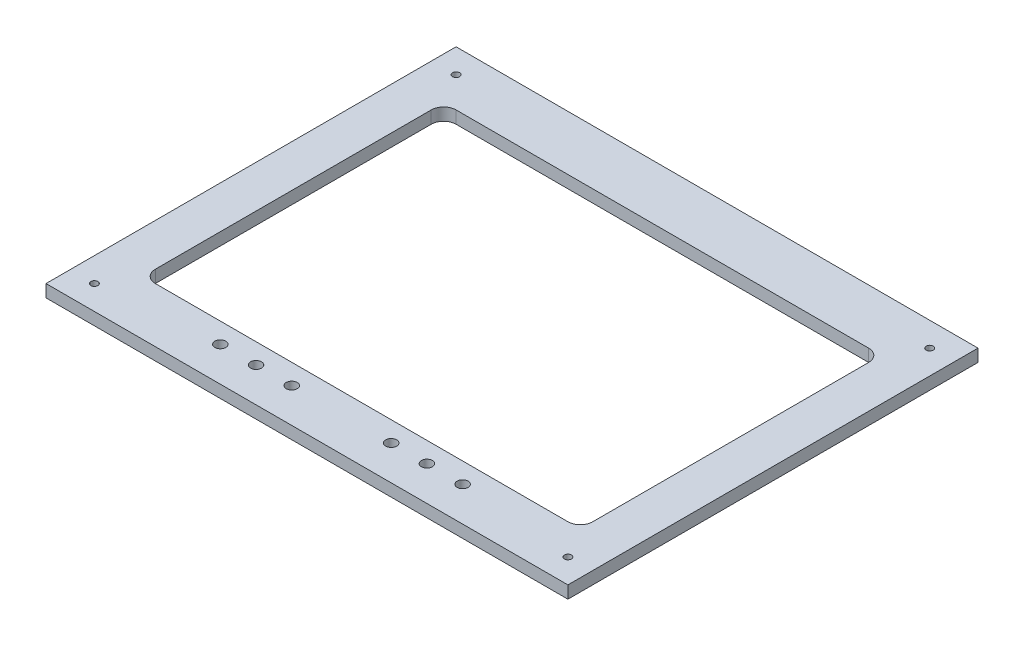
ISO-10303-21;
HEADER;
FILE_DESCRIPTION(('STEP AP214'),'2;1');
FILE_NAME('part.step','',(''),(''),'','','');
FILE_SCHEMA(('AUTOMOTIVE_DESIGN { 1 0 10303 214 1 1 1 1 }'));
ENDSEC;
DATA;
#1=APPLICATION_CONTEXT('core data for automotive mechanical design processes');
#2=APPLICATION_PROTOCOL_DEFINITION('international standard','automotive_design',2000,#1);
#3=PRODUCT_CONTEXT('',#1,'mechanical');
#4=PRODUCT('Part','Part','',(#3));
#5=PRODUCT_RELATED_PRODUCT_CATEGORY('part','',(#4));
#6=PRODUCT_DEFINITION_FORMATION('','',#4);
#7=PRODUCT_DEFINITION_CONTEXT('part definition',#1,'design');
#8=PRODUCT_DEFINITION('design','',#6,#7);
#9=PRODUCT_DEFINITION_SHAPE('','',#8);
#10=(LENGTH_UNIT() NAMED_UNIT(*) SI_UNIT(.MILLI.,.METRE.));
#11=(NAMED_UNIT(*) PLANE_ANGLE_UNIT() SI_UNIT($,.RADIAN.));
#12=(NAMED_UNIT(*) SI_UNIT($,.STERADIAN.) SOLID_ANGLE_UNIT());
#13=UNCERTAINTY_MEASURE_WITH_UNIT(LENGTH_MEASURE(1.E-05),#10,'distance_accuracy_value','');
#14=(GEOMETRIC_REPRESENTATION_CONTEXT(3) GLOBAL_UNCERTAINTY_ASSIGNED_CONTEXT((#13)) GLOBAL_UNIT_ASSIGNED_CONTEXT((#10,
#11,#12)) REPRESENTATION_CONTEXT('',''));
#15=CARTESIAN_POINT('',(0.,0.,0.));
#16=DIRECTION('',(0.,0.,1.));
#17=DIRECTION('',(1.,0.,0.));
#18=AXIS2_PLACEMENT_3D('',#15,#16,#17);
#19=CARTESIAN_POINT('',(133.35,6.35,-104.775));
#20=DIRECTION('',(-1.,0.,0.));
#21=DIRECTION('',(0.,0.,1.));
#22=AXIS2_PLACEMENT_3D('',#19,#20,#21);
#23=PLANE('',#22);
#24=DIRECTION('',(0.,0.,-1.));
#25=VECTOR('',#24,1.);
#26=CARTESIAN_POINT('',(133.35,0.,-104.775));
#27=LINE('',#26,#25);
#28=CARTESIAN_POINT('',(133.35,0.,104.775));
#29=VERTEX_POINT('',#28);
#30=CARTESIAN_POINT('',(133.35,0.,-104.775));
#31=VERTEX_POINT('',#30);
#32=EDGE_CURVE('E157',#29,#31,#27,.T.);
#33=ORIENTED_EDGE('',*,*,#32,.T.);
#34=DIRECTION('',(0.,-1.,0.));
#35=VECTOR('',#34,1.);
#36=CARTESIAN_POINT('',(133.35,6.35,-104.775));
#37=LINE('',#36,#35);
#38=CARTESIAN_POINT('',(133.35,6.35,-104.775));
#39=VERTEX_POINT('',#38);
#40=EDGE_CURVE('E136',#39,#31,#37,.T.);
#41=ORIENTED_EDGE('',*,*,#40,.F.);
#42=DIRECTION('',(0.,0.,-1.));
#43=VECTOR('',#42,1.);
#44=CARTESIAN_POINT('',(133.35,6.35,-104.775));
#45=LINE('',#44,#43);
#46=CARTESIAN_POINT('',(133.35,6.35,104.775));
#47=VERTEX_POINT('',#46);
#48=EDGE_CURVE('E144',#47,#39,#45,.T.);
#49=ORIENTED_EDGE('',*,*,#48,.F.);
#50=DIRECTION('',(0.,-1.,0.));
#51=VECTOR('',#50,1.);
#52=CARTESIAN_POINT('',(133.35,6.35,104.775));
#53=LINE('',#52,#51);
#54=EDGE_CURVE('E292',#47,#29,#53,.T.);
#55=ORIENTED_EDGE('',*,*,#54,.T.);
#56=EDGE_LOOP('',(#33,#41,#49,#55));
#57=FACE_BOUND('',#56,.T.);
#58=ADVANCED_FACE('F42',(#57),#23,.F.);
#59=CARTESIAN_POINT('',(-133.35,6.35,-104.775));
#60=DIRECTION('',(0.,0.,1.));
#61=DIRECTION('',(1.,0.,0.));
#62=AXIS2_PLACEMENT_3D('',#59,#60,#61);
#63=PLANE('',#62);
#64=DIRECTION('',(-1.,0.,0.));
#65=VECTOR('',#64,1.);
#66=CARTESIAN_POINT('',(-133.35,0.,-104.775));
#67=LINE('',#66,#65);
#68=CARTESIAN_POINT('',(-133.35,0.,-104.775));
#69=VERTEX_POINT('',#68);
#70=EDGE_CURVE('E295',#31,#69,#67,.T.);
#71=ORIENTED_EDGE('',*,*,#70,.T.);
#72=DIRECTION('',(0.,-1.,0.));
#73=VECTOR('',#72,1.);
#74=CARTESIAN_POINT('',(-133.35,6.35,-104.775));
#75=LINE('',#74,#73);
#76=CARTESIAN_POINT('',(-133.35,6.35,-104.775));
#77=VERTEX_POINT('',#76);
#78=EDGE_CURVE('E139',#77,#69,#75,.T.);
#79=ORIENTED_EDGE('',*,*,#78,.F.);
#80=DIRECTION('',(-1.,0.,0.));
#81=VECTOR('',#80,1.);
#82=CARTESIAN_POINT('',(-133.35,6.35,-104.775));
#83=LINE('',#82,#81);
#84=EDGE_CURVE('E132',#39,#77,#83,.T.);
#85=ORIENTED_EDGE('',*,*,#84,.F.);
#86=ORIENTED_EDGE('',*,*,#40,.T.);
#87=EDGE_LOOP('',(#71,#79,#85,#86));
#88=FACE_BOUND('',#87,.T.);
#89=ADVANCED_FACE('F134',(#88),#63,.F.);
#90=CARTESIAN_POINT('',(-133.35,6.35,-104.775));
#91=DIRECTION('',(1.,0.,0.));
#92=DIRECTION('',(0.,0.,-1.));
#93=AXIS2_PLACEMENT_3D('',#90,#91,#92);
#94=PLANE('',#93);
#95=DIRECTION('',(0.,0.,1.));
#96=VECTOR('',#95,1.);
#97=CARTESIAN_POINT('',(-133.35,0.,-104.775));
#98=LINE('',#97,#96);
#99=CARTESIAN_POINT('',(-133.35,0.,104.775));
#100=VERTEX_POINT('',#99);
#101=EDGE_CURVE('E298',#69,#100,#98,.T.);
#102=ORIENTED_EDGE('',*,*,#101,.T.);
#103=DIRECTION('',(0.,-1.,0.));
#104=VECTOR('',#103,1.);
#105=CARTESIAN_POINT('',(-133.35,6.35,104.775));
#106=LINE('',#105,#104);
#107=CARTESIAN_POINT('',(-133.35,6.35,104.775));
#108=VERTEX_POINT('',#107);
#109=EDGE_CURVE('E165',#108,#100,#106,.T.);
#110=ORIENTED_EDGE('',*,*,#109,.F.);
#111=DIRECTION('',(0.,0.,1.));
#112=VECTOR('',#111,1.);
#113=CARTESIAN_POINT('',(-133.35,6.35,-104.775));
#114=LINE('',#113,#112);
#115=EDGE_CURVE('E143',#77,#108,#114,.T.);
#116=ORIENTED_EDGE('',*,*,#115,.F.);
#117=ORIENTED_EDGE('',*,*,#78,.T.);
#118=EDGE_LOOP('',(#102,#110,#116,#117));
#119=FACE_BOUND('',#118,.T.);
#120=ADVANCED_FACE('F314',(#119),#94,.F.);
#121=CARTESIAN_POINT('',(-133.35,6.35,104.775));
#122=DIRECTION('',(0.,0.,-1.));
#123=DIRECTION('',(-1.,0.,0.));
#124=AXIS2_PLACEMENT_3D('',#121,#122,#123);
#125=PLANE('',#124);
#126=DIRECTION('',(1.,0.,0.));
#127=VECTOR('',#126,1.);
#128=CARTESIAN_POINT('',(-133.35,0.,104.775));
#129=LINE('',#128,#127);
#130=EDGE_CURVE('E154',#100,#29,#129,.T.);
#131=ORIENTED_EDGE('',*,*,#130,.T.);
#132=ORIENTED_EDGE('',*,*,#54,.F.);
#133=DIRECTION('',(1.,0.,0.));
#134=VECTOR('',#133,1.);
#135=CARTESIAN_POINT('',(-133.35,6.35,104.775));
#136=LINE('',#135,#134);
#137=EDGE_CURVE('E149',#108,#47,#136,.T.);
#138=ORIENTED_EDGE('',*,*,#137,.F.);
#139=ORIENTED_EDGE('',*,*,#109,.T.);
#140=EDGE_LOOP('',(#131,#132,#138,#139));
#141=FACE_BOUND('',#140,.T.);
#142=ADVANCED_FACE('F309',(#141),#125,.F.);
#143=CARTESIAN_POINT('',(0.,6.35,0.));
#144=DIRECTION('',(0.,1.,0.));
#145=DIRECTION('',(0.,0.,1.));
#146=AXIS2_PLACEMENT_3D('',#143,#144,#145);
#147=PLANE('',#146);
#148=CARTESIAN_POINT('',(-61.9125,6.35,87.1474));
#149=DIRECTION('',(0.,1.,0.));
#150=DIRECTION('',(0.,0.,1.));
#151=AXIS2_PLACEMENT_3D('',#148,#149,#150);
#152=CIRCLE('',#151,2.8067);
#153=CARTESIAN_POINT('',(-61.9125,6.35,89.9541));
#154=VERTEX_POINT('',#153);
#155=EDGE_CURVE('E450',#154,#154,#152,.T.);
#156=ORIENTED_EDGE('',*,*,#155,.F.);
#157=EDGE_LOOP('',(#156));
#158=FACE_BOUND('',#157,.T.);
#159=CARTESIAN_POINT('',(-43.65625,6.35,87.1474));
#160=DIRECTION('',(0.,1.,0.));
#161=DIRECTION('',(0.,0.,1.));
#162=AXIS2_PLACEMENT_3D('',#159,#160,#161);
#163=CIRCLE('',#162,2.8067);
#164=CARTESIAN_POINT('',(-43.65625,6.35,89.9541));
#165=VERTEX_POINT('',#164);
#166=EDGE_CURVE('E444',#165,#165,#163,.T.);
#167=ORIENTED_EDGE('',*,*,#166,.F.);
#168=EDGE_LOOP('',(#167));
#169=FACE_BOUND('',#168,.T.);
#170=CARTESIAN_POINT('',(-25.4,6.35,87.1474));
#171=DIRECTION('',(0.,1.,0.));
#172=DIRECTION('',(0.,0.,1.));
#173=AXIS2_PLACEMENT_3D('',#170,#171,#172);
#174=CIRCLE('',#173,2.8067);
#175=CARTESIAN_POINT('',(-25.4,6.35,89.9541));
#176=VERTEX_POINT('',#175);
#177=EDGE_CURVE('E438',#176,#176,#174,.T.);
#178=ORIENTED_EDGE('',*,*,#177,.F.);
#179=EDGE_LOOP('',(#178));
#180=FACE_BOUND('',#179,.T.);
#181=CARTESIAN_POINT('',(25.4,6.35,87.1474));
#182=DIRECTION('',(0.,1.,0.));
#183=DIRECTION('',(0.,0.,1.));
#184=AXIS2_PLACEMENT_3D('',#181,#182,#183);
#185=CIRCLE('',#184,2.8067);
#186=CARTESIAN_POINT('',(25.4,6.35,89.9541));
#187=VERTEX_POINT('',#186);
#188=EDGE_CURVE('E432',#187,#187,#185,.T.);
#189=ORIENTED_EDGE('',*,*,#188,.F.);
#190=EDGE_LOOP('',(#189));
#191=FACE_BOUND('',#190,.T.);
#192=CARTESIAN_POINT('',(43.65625,6.35,87.1474));
#193=DIRECTION('',(0.,1.,0.));
#194=DIRECTION('',(0.,0.,1.));
#195=AXIS2_PLACEMENT_3D('',#192,#193,#194);
#196=CIRCLE('',#195,2.8067);
#197=CARTESIAN_POINT('',(43.65625,6.35,89.9541));
#198=VERTEX_POINT('',#197);
#199=EDGE_CURVE('E424',#198,#198,#196,.T.);
#200=ORIENTED_EDGE('',*,*,#199,.F.);
#201=EDGE_LOOP('',(#200));
#202=FACE_BOUND('',#201,.T.);
#203=CARTESIAN_POINT('',(61.9125,6.35,87.1474));
#204=DIRECTION('',(0.,1.,0.));
#205=DIRECTION('',(0.,0.,1.));
#206=AXIS2_PLACEMENT_3D('',#203,#204,#205);
#207=CIRCLE('',#206,2.8067);
#208=CARTESIAN_POINT('',(61.9125,6.35,89.9541));
#209=VERTEX_POINT('',#208);
#210=EDGE_CURVE('E418',#209,#209,#207,.T.);
#211=ORIENTED_EDGE('',*,*,#210,.F.);
#212=EDGE_LOOP('',(#211));
#213=FACE_BOUND('',#212,.T.);
#214=DIRECTION('',(0.,0.,1.));
#215=VECTOR('',#214,1.);
#216=CARTESIAN_POINT('',(-111.76,6.35,76.835));
#217=LINE('',#216,#215);
#218=CARTESIAN_POINT('',(-111.76,6.35,-70.485));
#219=VERTEX_POINT('',#218);
#220=CARTESIAN_POINT('',(-111.76,6.35,70.485));
#221=VERTEX_POINT('',#220);
#222=EDGE_CURVE('E216',#219,#221,#217,.T.);
#223=ORIENTED_EDGE('',*,*,#222,.F.);
#224=CARTESIAN_POINT('',(-105.41,6.35,-70.485));
#225=DIRECTION('',(0.,1.,0.));
#226=DIRECTION('',(0.,0.,1.));
#227=AXIS2_PLACEMENT_3D('',#224,#225,#226);
#228=CIRCLE('',#227,6.35);
#229=CARTESIAN_POINT('',(-105.41,6.35,-76.835));
#230=VERTEX_POINT('',#229);
#231=EDGE_CURVE('E51',#219,#230,#228,.F.);
#232=ORIENTED_EDGE('',*,*,#231,.T.);
#233=DIRECTION('',(-1.,0.,0.));
#234=VECTOR('',#233,1.);
#235=CARTESIAN_POINT('',(111.76,6.35,-76.835));
#236=LINE('',#235,#234);
#237=CARTESIAN_POINT('',(105.41,6.35,-76.835));
#238=VERTEX_POINT('',#237);
#239=EDGE_CURVE('E215',#238,#230,#236,.T.);
#240=ORIENTED_EDGE('',*,*,#239,.F.);
#241=CARTESIAN_POINT('',(105.41,6.35,-70.485));
#242=DIRECTION('',(0.,1.,0.));
#243=DIRECTION('',(0.,0.,1.));
#244=AXIS2_PLACEMENT_3D('',#241,#242,#243);
#245=CIRCLE('',#244,6.35);
#246=CARTESIAN_POINT('',(111.76,6.35,-70.485));
#247=VERTEX_POINT('',#246);
#248=EDGE_CURVE('E192',#238,#247,#245,.F.);
#249=ORIENTED_EDGE('',*,*,#248,.T.);
#250=DIRECTION('',(0.,0.,-1.));
#251=VECTOR('',#250,1.);
#252=CARTESIAN_POINT('',(111.76,6.35,76.835));
#253=LINE('',#252,#251);
#254=CARTESIAN_POINT('',(111.76,6.35,70.485));
#255=VERTEX_POINT('',#254);
#256=EDGE_CURVE('E226',#255,#247,#253,.T.);
#257=ORIENTED_EDGE('',*,*,#256,.F.);
#258=CARTESIAN_POINT('',(105.41,6.35,70.485));
#259=DIRECTION('',(0.,1.,0.));
#260=DIRECTION('',(0.,0.,1.));
#261=AXIS2_PLACEMENT_3D('',#258,#259,#260);
#262=CIRCLE('',#261,6.35);
#263=CARTESIAN_POINT('',(105.41,6.35,76.835));
#264=VERTEX_POINT('',#263);
#265=EDGE_CURVE('E198',#255,#264,#262,.F.);
#266=ORIENTED_EDGE('',*,*,#265,.T.);
#267=DIRECTION('',(1.,0.,0.));
#268=VECTOR('',#267,1.);
#269=CARTESIAN_POINT('',(111.76,6.35,76.835));
#270=LINE('',#269,#268);
#271=CARTESIAN_POINT('',(-105.41,6.35,76.835));
#272=VERTEX_POINT('',#271);
#273=EDGE_CURVE('E250',#272,#264,#270,.T.);
#274=ORIENTED_EDGE('',*,*,#273,.F.);
#275=CARTESIAN_POINT('',(-105.41,6.35,70.485));
#276=DIRECTION('',(0.,1.,0.));
#277=DIRECTION('',(0.,0.,1.));
#278=AXIS2_PLACEMENT_3D('',#275,#276,#277);
#279=CIRCLE('',#278,6.35);
#280=EDGE_CURVE('E204',#272,#221,#279,.F.);
#281=ORIENTED_EDGE('',*,*,#280,.T.);
#282=EDGE_LOOP('',(#223,#232,#240,#249,#257,#266,#274,#281));
#283=FACE_BOUND('',#282,.T.);
#284=CARTESIAN_POINT('',(121.0056,6.35,92.4306));
#285=DIRECTION('',(0.,1.,0.));
#286=DIRECTION('',(0.,0.,1.));
#287=AXIS2_PLACEMENT_3D('',#284,#285,#286);
#288=CIRCLE('',#287,1.8);
#289=CARTESIAN_POINT('',(121.0056,6.35,94.2306));
#290=VERTEX_POINT('',#289);
#291=EDGE_CURVE('E247',#290,#290,#288,.T.);
#292=ORIENTED_EDGE('',*,*,#291,.F.);
#293=EDGE_LOOP('',(#292));
#294=FACE_BOUND('',#293,.T.);
#295=CARTESIAN_POINT('',(-121.0056,6.35,92.4306));
#296=DIRECTION('',(0.,1.,0.));
#297=DIRECTION('',(0.,0.,1.));
#298=AXIS2_PLACEMENT_3D('',#295,#296,#297);
#299=CIRCLE('',#298,1.8);
#300=CARTESIAN_POINT('',(-121.0056,6.35,94.2306));
#301=VERTEX_POINT('',#300);
#302=EDGE_CURVE('E264',#301,#301,#299,.T.);
#303=ORIENTED_EDGE('',*,*,#302,.F.);
#304=EDGE_LOOP('',(#303));
#305=FACE_BOUND('',#304,.T.);
#306=CARTESIAN_POINT('',(-121.0056,6.35,-92.4306));
#307=DIRECTION('',(0.,1.,0.));
#308=DIRECTION('',(0.,0.,1.));
#309=AXIS2_PLACEMENT_3D('',#306,#307,#308);
#310=CIRCLE('',#309,1.8);
#311=CARTESIAN_POINT('',(-121.0056,6.35,-90.6306));
#312=VERTEX_POINT('',#311);
#313=EDGE_CURVE('E272',#312,#312,#310,.T.);
#314=ORIENTED_EDGE('',*,*,#313,.F.);
#315=EDGE_LOOP('',(#314));
#316=FACE_BOUND('',#315,.T.);
#317=CARTESIAN_POINT('',(121.0056,6.35,-92.4306));
#318=DIRECTION('',(0.,1.,0.));
#319=DIRECTION('',(0.,0.,1.));
#320=AXIS2_PLACEMENT_3D('',#317,#318,#319);
#321=CIRCLE('',#320,1.8);
#322=CARTESIAN_POINT('',(121.0056,6.35,-90.6306));
#323=VERTEX_POINT('',#322);
#324=EDGE_CURVE('E280',#323,#323,#321,.T.);
#325=ORIENTED_EDGE('',*,*,#324,.F.);
#326=EDGE_LOOP('',(#325));
#327=FACE_BOUND('',#326,.T.);
#328=ORIENTED_EDGE('',*,*,#48,.T.);
#329=ORIENTED_EDGE('',*,*,#84,.T.);
#330=ORIENTED_EDGE('',*,*,#115,.T.);
#331=ORIENTED_EDGE('',*,*,#137,.T.);
#332=EDGE_LOOP('',(#328,#329,#330,#331));
#333=FACE_BOUND('',#332,.T.);
#334=ADVANCED_FACE('F147',(#158,#169,#180,#191,#202,#213,#283,#294,#305,#316,#327,#333),#147,.T.);
#335=CARTESIAN_POINT('',(0.,0.,0.));
#336=DIRECTION('',(0.,1.,0.));
#337=DIRECTION('',(0.,0.,1.));
#338=AXIS2_PLACEMENT_3D('',#335,#336,#337);
#339=PLANE('',#338);
#340=CARTESIAN_POINT('',(-61.9125,0.,87.1474));
#341=DIRECTION('',(0.,1.,0.));
#342=DIRECTION('',(0.,0.,1.));
#343=AXIS2_PLACEMENT_3D('',#340,#341,#342);
#344=CIRCLE('',#343,2.8067);
#345=CARTESIAN_POINT('',(-61.9125,0.,89.9541));
#346=VERTEX_POINT('',#345);
#347=EDGE_CURVE('E397',#346,#346,#344,.T.);
#348=ORIENTED_EDGE('',*,*,#347,.T.);
#349=EDGE_LOOP('',(#348));
#350=FACE_BOUND('',#349,.T.);
#351=CARTESIAN_POINT('',(-43.65625,0.,87.1474));
#352=DIRECTION('',(0.,1.,0.));
#353=DIRECTION('',(0.,0.,1.));
#354=AXIS2_PLACEMENT_3D('',#351,#352,#353);
#355=CIRCLE('',#354,2.8067);
#356=CARTESIAN_POINT('',(-43.65625,0.,89.9541));
#357=VERTEX_POINT('',#356);
#358=EDGE_CURVE('E401',#357,#357,#355,.T.);
#359=ORIENTED_EDGE('',*,*,#358,.T.);
#360=EDGE_LOOP('',(#359));
#361=FACE_BOUND('',#360,.T.);
#362=CARTESIAN_POINT('',(-25.4,0.,87.1474));
#363=DIRECTION('',(0.,1.,0.));
#364=DIRECTION('',(0.,0.,1.));
#365=AXIS2_PLACEMENT_3D('',#362,#363,#364);
#366=CIRCLE('',#365,2.8067);
#367=CARTESIAN_POINT('',(-25.4,0.,89.9541));
#368=VERTEX_POINT('',#367);
#369=EDGE_CURVE('E405',#368,#368,#366,.T.);
#370=ORIENTED_EDGE('',*,*,#369,.T.);
#371=EDGE_LOOP('',(#370));
#372=FACE_BOUND('',#371,.T.);
#373=CARTESIAN_POINT('',(25.4,0.,87.1474));
#374=DIRECTION('',(0.,1.,0.));
#375=DIRECTION('',(0.,0.,1.));
#376=AXIS2_PLACEMENT_3D('',#373,#374,#375);
#377=CIRCLE('',#376,2.8067);
#378=CARTESIAN_POINT('',(25.4,0.,89.9541));
#379=VERTEX_POINT('',#378);
#380=EDGE_CURVE('E409',#379,#379,#377,.T.);
#381=ORIENTED_EDGE('',*,*,#380,.T.);
#382=EDGE_LOOP('',(#381));
#383=FACE_BOUND('',#382,.T.);
#384=CARTESIAN_POINT('',(43.65625,0.,87.1474));
#385=DIRECTION('',(0.,1.,0.));
#386=DIRECTION('',(0.,0.,1.));
#387=AXIS2_PLACEMENT_3D('',#384,#385,#386);
#388=CIRCLE('',#387,2.8067);
#389=CARTESIAN_POINT('',(43.65625,0.,89.9541));
#390=VERTEX_POINT('',#389);
#391=EDGE_CURVE('E413',#390,#390,#388,.T.);
#392=ORIENTED_EDGE('',*,*,#391,.T.);
#393=EDGE_LOOP('',(#392));
#394=FACE_BOUND('',#393,.T.);
#395=CARTESIAN_POINT('',(61.9125,0.,87.1474));
#396=DIRECTION('',(0.,1.,0.));
#397=DIRECTION('',(0.,0.,1.));
#398=AXIS2_PLACEMENT_3D('',#395,#396,#397);
#399=CIRCLE('',#398,2.8067);
#400=CARTESIAN_POINT('',(61.9125,0.,89.9541));
#401=VERTEX_POINT('',#400);
#402=EDGE_CURVE('E238',#401,#401,#399,.T.);
#403=ORIENTED_EDGE('',*,*,#402,.T.);
#404=EDGE_LOOP('',(#403));
#405=FACE_BOUND('',#404,.T.);
#406=DIRECTION('',(0.,0.,-1.));
#407=VECTOR('',#406,1.);
#408=CARTESIAN_POINT('',(111.76,0.,76.835));
#409=LINE('',#408,#407);
#410=CARTESIAN_POINT('',(111.76,0.,70.485));
#411=VERTEX_POINT('',#410);
#412=CARTESIAN_POINT('',(111.76,0.,-70.485));
#413=VERTEX_POINT('',#412);
#414=EDGE_CURVE('E235',#411,#413,#409,.T.);
#415=ORIENTED_EDGE('',*,*,#414,.T.);
#416=CARTESIAN_POINT('',(105.41,0.,-70.485));
#417=DIRECTION('',(0.,1.,0.));
#418=DIRECTION('',(0.,0.,1.));
#419=AXIS2_PLACEMENT_3D('',#416,#417,#418);
#420=CIRCLE('',#419,6.35);
#421=CARTESIAN_POINT('',(105.41,0.,-76.835));
#422=VERTEX_POINT('',#421);
#423=EDGE_CURVE('E195',#413,#422,#420,.T.);
#424=ORIENTED_EDGE('',*,*,#423,.T.);
#425=DIRECTION('',(-1.,0.,0.));
#426=VECTOR('',#425,1.);
#427=CARTESIAN_POINT('',(111.76,0.,-76.835));
#428=LINE('',#427,#426);
#429=CARTESIAN_POINT('',(-105.41,0.,-76.835));
#430=VERTEX_POINT('',#429);
#431=EDGE_CURVE('E244',#422,#430,#428,.T.);
#432=ORIENTED_EDGE('',*,*,#431,.T.);
#433=CARTESIAN_POINT('',(-105.41,0.,-70.485));
#434=DIRECTION('',(0.,1.,0.));
#435=DIRECTION('',(0.,0.,1.));
#436=AXIS2_PLACEMENT_3D('',#433,#434,#435);
#437=CIRCLE('',#436,6.35);
#438=CARTESIAN_POINT('',(-111.76,0.,-70.485));
#439=VERTEX_POINT('',#438);
#440=EDGE_CURVE('E11',#430,#439,#437,.T.);
#441=ORIENTED_EDGE('',*,*,#440,.T.);
#442=DIRECTION('',(0.,0.,1.));
#443=VECTOR('',#442,1.);
#444=CARTESIAN_POINT('',(-111.76,0.,76.835));
#445=LINE('',#444,#443);
#446=CARTESIAN_POINT('',(-111.76,0.,70.485));
#447=VERTEX_POINT('',#446);
#448=EDGE_CURVE('E225',#439,#447,#445,.T.);
#449=ORIENTED_EDGE('',*,*,#448,.T.);
#450=CARTESIAN_POINT('',(-105.41,0.,70.485));
#451=DIRECTION('',(0.,1.,0.));
#452=DIRECTION('',(0.,0.,1.));
#453=AXIS2_PLACEMENT_3D('',#450,#451,#452);
#454=CIRCLE('',#453,6.35);
#455=CARTESIAN_POINT('',(-105.41,0.,76.835));
#456=VERTEX_POINT('',#455);
#457=EDGE_CURVE('E207',#447,#456,#454,.T.);
#458=ORIENTED_EDGE('',*,*,#457,.T.);
#459=DIRECTION('',(1.,0.,0.));
#460=VECTOR('',#459,1.);
#461=CARTESIAN_POINT('',(111.76,0.,76.835));
#462=LINE('',#461,#460);
#463=CARTESIAN_POINT('',(105.41,0.,76.835));
#464=VERTEX_POINT('',#463);
#465=EDGE_CURVE('E231',#456,#464,#462,.T.);
#466=ORIENTED_EDGE('',*,*,#465,.T.);
#467=CARTESIAN_POINT('',(105.41,0.,70.485));
#468=DIRECTION('',(0.,1.,0.));
#469=DIRECTION('',(0.,0.,1.));
#470=AXIS2_PLACEMENT_3D('',#467,#468,#469);
#471=CIRCLE('',#470,6.35);
#472=EDGE_CURVE('E201',#464,#411,#471,.T.);
#473=ORIENTED_EDGE('',*,*,#472,.T.);
#474=EDGE_LOOP('',(#415,#424,#432,#441,#449,#458,#466,#473));
#475=FACE_BOUND('',#474,.T.);
#476=CARTESIAN_POINT('',(121.0056,0.,92.4306));
#477=DIRECTION('',(0.,1.,0.));
#478=DIRECTION('',(0.,0.,1.));
#479=AXIS2_PLACEMENT_3D('',#476,#477,#478);
#480=CIRCLE('',#479,1.8);
#481=CARTESIAN_POINT('',(121.0056,0.,94.2306));
#482=VERTEX_POINT('',#481);
#483=EDGE_CURVE('E260',#482,#482,#480,.T.);
#484=ORIENTED_EDGE('',*,*,#483,.T.);
#485=EDGE_LOOP('',(#484));
#486=FACE_BOUND('',#485,.T.);
#487=CARTESIAN_POINT('',(-121.0056,0.,92.4306));
#488=DIRECTION('',(0.,1.,0.));
#489=DIRECTION('',(0.,0.,1.));
#490=AXIS2_PLACEMENT_3D('',#487,#488,#489);
#491=CIRCLE('',#490,1.8);
#492=CARTESIAN_POINT('',(-121.0056,0.,94.2306));
#493=VERTEX_POINT('',#492);
#494=EDGE_CURVE('E268',#493,#493,#491,.T.);
#495=ORIENTED_EDGE('',*,*,#494,.T.);
#496=EDGE_LOOP('',(#495));
#497=FACE_BOUND('',#496,.T.);
#498=CARTESIAN_POINT('',(-121.0056,0.,-92.4306));
#499=DIRECTION('',(0.,1.,0.));
#500=DIRECTION('',(0.,0.,1.));
#501=AXIS2_PLACEMENT_3D('',#498,#499,#500);
#502=CIRCLE('',#501,1.8);
#503=CARTESIAN_POINT('',(-121.0056,0.,-90.6306));
#504=VERTEX_POINT('',#503);
#505=EDGE_CURVE('E276',#504,#504,#502,.T.);
#506=ORIENTED_EDGE('',*,*,#505,.T.);
#507=EDGE_LOOP('',(#506));
#508=FACE_BOUND('',#507,.T.);
#509=CARTESIAN_POINT('',(121.0056,0.,-92.4306));
#510=DIRECTION('',(0.,1.,0.));
#511=DIRECTION('',(0.,0.,1.));
#512=AXIS2_PLACEMENT_3D('',#509,#510,#511);
#513=CIRCLE('',#512,1.8);
#514=CARTESIAN_POINT('',(121.0056,0.,-90.6306));
#515=VERTEX_POINT('',#514);
#516=EDGE_CURVE('E284',#515,#515,#513,.T.);
#517=ORIENTED_EDGE('',*,*,#516,.T.);
#518=EDGE_LOOP('',(#517));
#519=FACE_BOUND('',#518,.T.);
#520=ORIENTED_EDGE('',*,*,#32,.F.);
#521=ORIENTED_EDGE('',*,*,#130,.F.);
#522=ORIENTED_EDGE('',*,*,#101,.F.);
#523=ORIENTED_EDGE('',*,*,#70,.F.);
#524=EDGE_LOOP('',(#520,#521,#522,#523));
#525=FACE_BOUND('',#524,.T.);
#526=ADVANCED_FACE('F313',(#350,#361,#372,#383,#394,#405,#475,#486,#497,#508,#519,#525),#339,.F.);
#527=CARTESIAN_POINT('',(121.0056,6.35,-92.4306));
#528=DIRECTION('',(0.,1.,0.));
#529=DIRECTION('',(0.,0.,1.));
#530=AXIS2_PLACEMENT_3D('',#527,#528,#529);
#531=CYLINDRICAL_SURFACE('',#530,1.8);
#532=ORIENTED_EDGE('',*,*,#516,.F.);
#533=EDGE_LOOP('',(#532));
#534=FACE_BOUND('',#533,.T.);
#535=ORIENTED_EDGE('',*,*,#324,.T.);
#536=EDGE_LOOP('',(#535));
#537=FACE_BOUND('',#536,.T.);
#538=ADVANCED_FACE('F381',(#534,#537),#531,.F.);
#539=CARTESIAN_POINT('',(-121.0056,6.35,-92.4306));
#540=DIRECTION('',(0.,1.,0.));
#541=DIRECTION('',(0.,0.,1.));
#542=AXIS2_PLACEMENT_3D('',#539,#540,#541);
#543=CYLINDRICAL_SURFACE('',#542,1.8);
#544=ORIENTED_EDGE('',*,*,#505,.F.);
#545=EDGE_LOOP('',(#544));
#546=FACE_BOUND('',#545,.T.);
#547=ORIENTED_EDGE('',*,*,#313,.T.);
#548=EDGE_LOOP('',(#547));
#549=FACE_BOUND('',#548,.T.);
#550=ADVANCED_FACE('F377',(#546,#549),#543,.F.);
#551=CARTESIAN_POINT('',(-121.0056,6.35,92.4306));
#552=DIRECTION('',(0.,1.,0.));
#553=DIRECTION('',(0.,0.,1.));
#554=AXIS2_PLACEMENT_3D('',#551,#552,#553);
#555=CYLINDRICAL_SURFACE('',#554,1.8);
#556=ORIENTED_EDGE('',*,*,#494,.F.);
#557=EDGE_LOOP('',(#556));
#558=FACE_BOUND('',#557,.T.);
#559=ORIENTED_EDGE('',*,*,#302,.T.);
#560=EDGE_LOOP('',(#559));
#561=FACE_BOUND('',#560,.T.);
#562=ADVANCED_FACE('F373',(#558,#561),#555,.F.);
#563=CARTESIAN_POINT('',(121.0056,6.35,92.4306));
#564=DIRECTION('',(0.,1.,0.));
#565=DIRECTION('',(0.,0.,1.));
#566=AXIS2_PLACEMENT_3D('',#563,#564,#565);
#567=CYLINDRICAL_SURFACE('',#566,1.8);
#568=ORIENTED_EDGE('',*,*,#483,.F.);
#569=EDGE_LOOP('',(#568));
#570=FACE_BOUND('',#569,.T.);
#571=ORIENTED_EDGE('',*,*,#291,.T.);
#572=EDGE_LOOP('',(#571));
#573=FACE_BOUND('',#572,.T.);
#574=ADVANCED_FACE('F370',(#570,#573),#567,.F.);
#575=CARTESIAN_POINT('',(-111.76,0.,76.835));
#576=DIRECTION('',(-1.,0.,0.));
#577=DIRECTION('',(0.,0.,1.));
#578=AXIS2_PLACEMENT_3D('',#575,#576,#577);
#579=PLANE('',#578);
#580=ORIENTED_EDGE('',*,*,#222,.T.);
#581=DIRECTION('',(0.,1.,0.));
#582=VECTOR('',#581,1.);
#583=CARTESIAN_POINT('',(-111.76,0.,70.485));
#584=LINE('',#583,#582);
#585=EDGE_CURVE('E58',#221,#447,#584,.F.);
#586=ORIENTED_EDGE('',*,*,#585,.T.);
#587=ORIENTED_EDGE('',*,*,#448,.F.);
#588=DIRECTION('',(0.,1.,0.));
#589=VECTOR('',#588,1.);
#590=CARTESIAN_POINT('',(-111.76,6.35,-70.485));
#591=LINE('',#590,#589);
#592=EDGE_CURVE('E186',#439,#219,#591,.T.);
#593=ORIENTED_EDGE('',*,*,#592,.T.);
#594=EDGE_LOOP('',(#580,#586,#587,#593));
#595=FACE_BOUND('',#594,.T.);
#596=ADVANCED_FACE('F228',(#595),#579,.F.);
#597=CARTESIAN_POINT('',(111.76,0.,-76.835));
#598=DIRECTION('',(0.,0.,-1.));
#599=DIRECTION('',(-1.,0.,0.));
#600=AXIS2_PLACEMENT_3D('',#597,#598,#599);
#601=PLANE('',#600);
#602=ORIENTED_EDGE('',*,*,#431,.F.);
#603=DIRECTION('',(0.,1.,0.));
#604=VECTOR('',#603,1.);
#605=CARTESIAN_POINT('',(105.41,6.35,-76.835));
#606=LINE('',#605,#604);
#607=EDGE_CURVE('E163',#422,#238,#606,.T.);
#608=ORIENTED_EDGE('',*,*,#607,.T.);
#609=ORIENTED_EDGE('',*,*,#239,.T.);
#610=DIRECTION('',(0.,1.,0.));
#611=VECTOR('',#610,1.);
#612=CARTESIAN_POINT('',(-105.41,0.,-76.835));
#613=LINE('',#612,#611);
#614=EDGE_CURVE('E159',#230,#430,#613,.F.);
#615=ORIENTED_EDGE('',*,*,#614,.T.);
#616=EDGE_LOOP('',(#602,#608,#609,#615));
#617=FACE_BOUND('',#616,.T.);
#618=ADVANCED_FACE('F222',(#617),#601,.F.);
#619=CARTESIAN_POINT('',(111.76,0.,76.835));
#620=DIRECTION('',(1.,0.,0.));
#621=DIRECTION('',(0.,0.,-1.));
#622=AXIS2_PLACEMENT_3D('',#619,#620,#621);
#623=PLANE('',#622);
#624=ORIENTED_EDGE('',*,*,#256,.T.);
#625=DIRECTION('',(0.,1.,0.));
#626=VECTOR('',#625,1.);
#627=CARTESIAN_POINT('',(111.76,0.,-70.485));
#628=LINE('',#627,#626);
#629=EDGE_CURVE('E176',#247,#413,#628,.F.);
#630=ORIENTED_EDGE('',*,*,#629,.T.);
#631=ORIENTED_EDGE('',*,*,#414,.F.);
#632=DIRECTION('',(0.,1.,0.));
#633=VECTOR('',#632,1.);
#634=CARTESIAN_POINT('',(111.76,6.35,70.485));
#635=LINE('',#634,#633);
#636=EDGE_CURVE('E172',#411,#255,#635,.T.);
#637=ORIENTED_EDGE('',*,*,#636,.T.);
#638=EDGE_LOOP('',(#624,#630,#631,#637));
#639=FACE_BOUND('',#638,.T.);
#640=ADVANCED_FACE('F354',(#639),#623,.F.);
#641=CARTESIAN_POINT('',(111.76,0.,76.835));
#642=DIRECTION('',(0.,0.,1.));
#643=DIRECTION('',(1.,0.,0.));
#644=AXIS2_PLACEMENT_3D('',#641,#642,#643);
#645=PLANE('',#644);
#646=ORIENTED_EDGE('',*,*,#273,.T.);
#647=DIRECTION('',(0.,1.,0.));
#648=VECTOR('',#647,1.);
#649=CARTESIAN_POINT('',(105.41,0.,76.835));
#650=LINE('',#649,#648);
#651=EDGE_CURVE('E183',#264,#464,#650,.F.);
#652=ORIENTED_EDGE('',*,*,#651,.T.);
#653=ORIENTED_EDGE('',*,*,#465,.F.);
#654=DIRECTION('',(0.,1.,0.));
#655=VECTOR('',#654,1.);
#656=CARTESIAN_POINT('',(-105.41,6.35,76.835));
#657=LINE('',#656,#655);
#658=EDGE_CURVE('E179',#456,#272,#657,.T.);
#659=ORIENTED_EDGE('',*,*,#658,.T.);
#660=EDGE_LOOP('',(#646,#652,#653,#659));
#661=FACE_BOUND('',#660,.T.);
#662=ADVANCED_FACE('F347',(#661),#645,.F.);
#663=CARTESIAN_POINT('',(61.9125,6.35,87.1474));
#664=DIRECTION('',(0.,1.,0.));
#665=DIRECTION('',(0.,0.,1.));
#666=AXIS2_PLACEMENT_3D('',#663,#664,#665);
#667=CYLINDRICAL_SURFACE('',#666,2.8067);
#668=ORIENTED_EDGE('',*,*,#402,.F.);
#669=EDGE_LOOP('',(#668));
#670=FACE_BOUND('',#669,.T.);
#671=ORIENTED_EDGE('',*,*,#210,.T.);
#672=EDGE_LOOP('',(#671));
#673=FACE_BOUND('',#672,.T.);
#674=ADVANCED_FACE('F363',(#670,#673),#667,.F.);
#675=CARTESIAN_POINT('',(43.65625,6.35,87.1474));
#676=DIRECTION('',(0.,1.,0.));
#677=DIRECTION('',(0.,0.,1.));
#678=AXIS2_PLACEMENT_3D('',#675,#676,#677);
#679=CYLINDRICAL_SURFACE('',#678,2.8067);
#680=ORIENTED_EDGE('',*,*,#391,.F.);
#681=EDGE_LOOP('',(#680));
#682=FACE_BOUND('',#681,.T.);
#683=ORIENTED_EDGE('',*,*,#199,.T.);
#684=EDGE_LOOP('',(#683));
#685=FACE_BOUND('',#684,.T.);
#686=ADVANCED_FACE('F465',(#682,#685),#679,.F.);
#687=CARTESIAN_POINT('',(25.4,6.35,87.1474));
#688=DIRECTION('',(0.,1.,0.));
#689=DIRECTION('',(0.,0.,1.));
#690=AXIS2_PLACEMENT_3D('',#687,#688,#689);
#691=CYLINDRICAL_SURFACE('',#690,2.8067);
#692=ORIENTED_EDGE('',*,*,#380,.F.);
#693=EDGE_LOOP('',(#692));
#694=FACE_BOUND('',#693,.T.);
#695=ORIENTED_EDGE('',*,*,#188,.T.);
#696=EDGE_LOOP('',(#695));
#697=FACE_BOUND('',#696,.T.);
#698=ADVANCED_FACE('F467',(#694,#697),#691,.F.);
#699=CARTESIAN_POINT('',(-25.4,6.35,87.1474));
#700=DIRECTION('',(0.,1.,0.));
#701=DIRECTION('',(0.,0.,1.));
#702=AXIS2_PLACEMENT_3D('',#699,#700,#701);
#703=CYLINDRICAL_SURFACE('',#702,2.8067);
#704=ORIENTED_EDGE('',*,*,#369,.F.);
#705=EDGE_LOOP('',(#704));
#706=FACE_BOUND('',#705,.T.);
#707=ORIENTED_EDGE('',*,*,#177,.T.);
#708=EDGE_LOOP('',(#707));
#709=FACE_BOUND('',#708,.T.);
#710=ADVANCED_FACE('F474',(#706,#709),#703,.F.);
#711=CARTESIAN_POINT('',(-43.65625,6.35,87.1474));
#712=DIRECTION('',(0.,1.,0.));
#713=DIRECTION('',(0.,0.,1.));
#714=AXIS2_PLACEMENT_3D('',#711,#712,#713);
#715=CYLINDRICAL_SURFACE('',#714,2.8067);
#716=ORIENTED_EDGE('',*,*,#358,.F.);
#717=EDGE_LOOP('',(#716));
#718=FACE_BOUND('',#717,.T.);
#719=ORIENTED_EDGE('',*,*,#166,.T.);
#720=EDGE_LOOP('',(#719));
#721=FACE_BOUND('',#720,.T.);
#722=ADVANCED_FACE('F480',(#718,#721),#715,.F.);
#723=CARTESIAN_POINT('',(-61.9125,6.35,87.1474));
#724=DIRECTION('',(0.,1.,0.));
#725=DIRECTION('',(0.,0.,1.));
#726=AXIS2_PLACEMENT_3D('',#723,#724,#725);
#727=CYLINDRICAL_SURFACE('',#726,2.8067);
#728=ORIENTED_EDGE('',*,*,#347,.F.);
#729=EDGE_LOOP('',(#728));
#730=FACE_BOUND('',#729,.T.);
#731=ORIENTED_EDGE('',*,*,#155,.T.);
#732=EDGE_LOOP('',(#731));
#733=FACE_BOUND('',#732,.T.);
#734=ADVANCED_FACE('F332',(#730,#733),#727,.F.);
#735=CARTESIAN_POINT('',(105.41,0.,-70.485));
#736=DIRECTION('',(0.,-1.,0.));
#737=DIRECTION('',(0.,0.,-1.));
#738=AXIS2_PLACEMENT_3D('',#735,#736,#737);
#739=CYLINDRICAL_SURFACE('',#738,6.35);
#740=ORIENTED_EDGE('',*,*,#423,.F.);
#741=ORIENTED_EDGE('',*,*,#629,.F.);
#742=ORIENTED_EDGE('',*,*,#248,.F.);
#743=ORIENTED_EDGE('',*,*,#607,.F.);
#744=EDGE_LOOP('',(#740,#741,#742,#743));
#745=FACE_BOUND('',#744,.T.);
#746=ADVANCED_FACE('F328',(#745),#739,.F.);
#747=CARTESIAN_POINT('',(105.41,0.,70.485));
#748=DIRECTION('',(0.,-1.,0.));
#749=DIRECTION('',(0.,0.,-1.));
#750=AXIS2_PLACEMENT_3D('',#747,#748,#749);
#751=CYLINDRICAL_SURFACE('',#750,6.35);
#752=ORIENTED_EDGE('',*,*,#472,.F.);
#753=ORIENTED_EDGE('',*,*,#651,.F.);
#754=ORIENTED_EDGE('',*,*,#265,.F.);
#755=ORIENTED_EDGE('',*,*,#636,.F.);
#756=EDGE_LOOP('',(#752,#753,#754,#755));
#757=FACE_BOUND('',#756,.T.);
#758=ADVANCED_FACE('F331',(#757),#751,.F.);
#759=CARTESIAN_POINT('',(-105.41,0.,70.485));
#760=DIRECTION('',(0.,-1.,0.));
#761=DIRECTION('',(0.,0.,-1.));
#762=AXIS2_PLACEMENT_3D('',#759,#760,#761);
#763=CYLINDRICAL_SURFACE('',#762,6.35);
#764=ORIENTED_EDGE('',*,*,#457,.F.);
#765=ORIENTED_EDGE('',*,*,#585,.F.);
#766=ORIENTED_EDGE('',*,*,#280,.F.);
#767=ORIENTED_EDGE('',*,*,#658,.F.);
#768=EDGE_LOOP('',(#764,#765,#766,#767));
#769=FACE_BOUND('',#768,.T.);
#770=ADVANCED_FACE('F335',(#769),#763,.F.);
#771=CARTESIAN_POINT('',(-105.41,0.,-70.485));
#772=DIRECTION('',(0.,-1.,0.));
#773=DIRECTION('',(0.,0.,-1.));
#774=AXIS2_PLACEMENT_3D('',#771,#772,#773);
#775=CYLINDRICAL_SURFACE('',#774,6.35);
#776=ORIENTED_EDGE('',*,*,#440,.F.);
#777=ORIENTED_EDGE('',*,*,#614,.F.);
#778=ORIENTED_EDGE('',*,*,#231,.F.);
#779=ORIENTED_EDGE('',*,*,#592,.F.);
#780=EDGE_LOOP('',(#776,#777,#778,#779));
#781=FACE_BOUND('',#780,.T.);
#782=ADVANCED_FACE('F44',(#781),#775,.F.);
#783=CLOSED_SHELL('',(#58,#89,#120,#142,#334,#526,#538,#550,#562,#574,#596,#618,#640,#662,#674,
#686,#698,#710,#722,#734,#746,#758,#770,#782));
#784=MANIFOLD_SOLID_BREP('B2',#783);
#785=ADVANCED_BREP_SHAPE_REPRESENTATION('',(#18,#784),#14);
#786=SHAPE_DEFINITION_REPRESENTATION(#9,#785);
ENDSEC;
END-ISO-10303-21;
